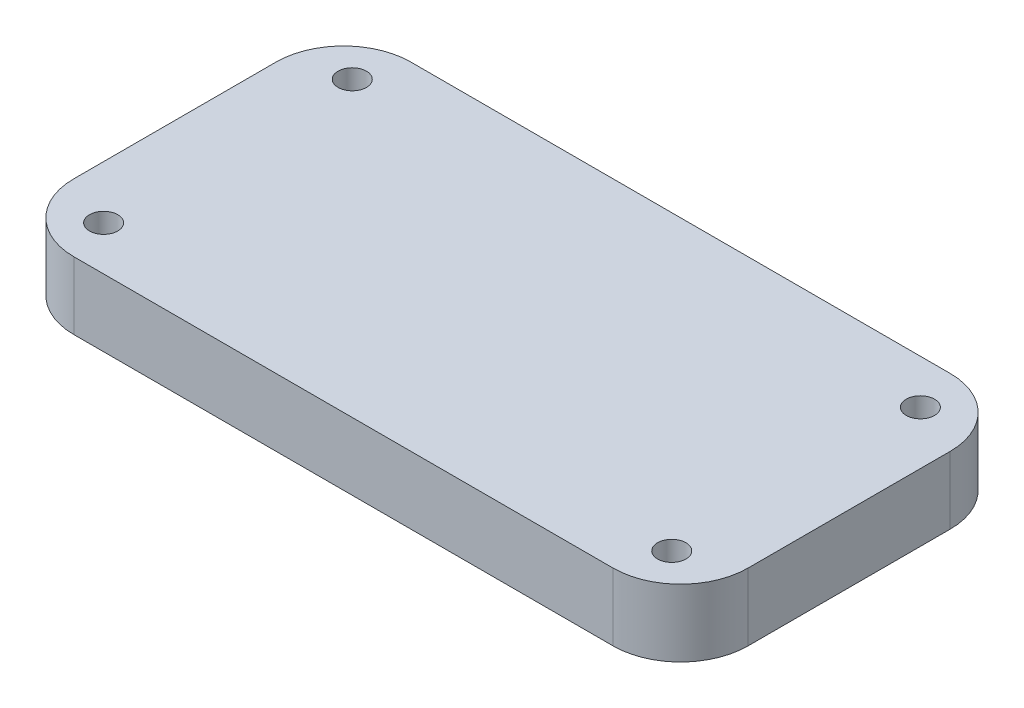
ISO-10303-21;
HEADER;
FILE_DESCRIPTION(('STEP AP214'),'2;1');
FILE_NAME('part.step','',(''),(''),'','','');
FILE_SCHEMA(('AUTOMOTIVE_DESIGN { 1 0 10303 214 1 1 1 1 }'));
ENDSEC;
DATA;
#1=APPLICATION_CONTEXT('core data for automotive mechanical design processes');
#2=APPLICATION_PROTOCOL_DEFINITION('international standard','automotive_design',2000,#1);
#3=PRODUCT_CONTEXT('',#1,'mechanical');
#4=PRODUCT('Part','Part','',(#3));
#5=PRODUCT_RELATED_PRODUCT_CATEGORY('part','',(#4));
#6=PRODUCT_DEFINITION_FORMATION('','',#4);
#7=PRODUCT_DEFINITION_CONTEXT('part definition',#1,'design');
#8=PRODUCT_DEFINITION('design','',#6,#7);
#9=PRODUCT_DEFINITION_SHAPE('','',#8);
#10=(LENGTH_UNIT() NAMED_UNIT(*) SI_UNIT(.MILLI.,.METRE.));
#11=(NAMED_UNIT(*) PLANE_ANGLE_UNIT() SI_UNIT($,.RADIAN.));
#12=(NAMED_UNIT(*) SI_UNIT($,.STERADIAN.) SOLID_ANGLE_UNIT());
#13=UNCERTAINTY_MEASURE_WITH_UNIT(LENGTH_MEASURE(1.E-05),#10,'distance_accuracy_value','');
#14=(GEOMETRIC_REPRESENTATION_CONTEXT(3) GLOBAL_UNCERTAINTY_ASSIGNED_CONTEXT((#13)) GLOBAL_UNIT_ASSIGNED_CONTEXT((#10,
#11,#12)) REPRESENTATION_CONTEXT('',''));
#15=CARTESIAN_POINT('',(0.,0.,0.));
#16=DIRECTION('',(0.,0.,1.));
#17=DIRECTION('',(1.,0.,0.));
#18=AXIS2_PLACEMENT_3D('',#15,#16,#17);
#19=CARTESIAN_POINT('',(-50.,10.,-25.));
#20=DIRECTION('',(1.,0.,0.));
#21=DIRECTION('',(0.,0.,-1.));
#22=AXIS2_PLACEMENT_3D('',#19,#20,#21);
#23=PLANE('',#22);
#24=DIRECTION('',(0.,0.,1.));
#25=VECTOR('',#24,1.);
#26=CARTESIAN_POINT('',(-50.,10.,-25.));
#27=LINE('',#26,#25);
#28=CARTESIAN_POINT('',(-50.,10.,-15.));
#29=VERTEX_POINT('',#28);
#30=CARTESIAN_POINT('',(-50.,10.,15.));
#31=VERTEX_POINT('',#30);
#32=EDGE_CURVE('E126',#29,#31,#27,.T.);
#33=ORIENTED_EDGE('',*,*,#32,.F.);
#34=DIRECTION('',(0.,-1.,0.));
#35=VECTOR('',#34,1.);
#36=CARTESIAN_POINT('',(-50.,10.,-15.));
#37=LINE('',#36,#35);
#38=CARTESIAN_POINT('',(-50.,0.,-15.));
#39=VERTEX_POINT('',#38);
#40=EDGE_CURVE('E111',#29,#39,#37,.T.);
#41=ORIENTED_EDGE('',*,*,#40,.T.);
#42=DIRECTION('',(0.,0.,1.));
#43=VECTOR('',#42,1.);
#44=CARTESIAN_POINT('',(-50.,0.,-25.));
#45=LINE('',#44,#43);
#46=CARTESIAN_POINT('',(-50.,0.,15.));
#47=VERTEX_POINT('',#46);
#48=EDGE_CURVE('E123',#39,#47,#45,.T.);
#49=ORIENTED_EDGE('',*,*,#48,.T.);
#50=DIRECTION('',(0.,-1.,0.));
#51=VECTOR('',#50,1.);
#52=CARTESIAN_POINT('',(-50.,10.,15.));
#53=LINE('',#52,#51);
#54=EDGE_CURVE('E128',#47,#31,#53,.F.);
#55=ORIENTED_EDGE('',*,*,#54,.T.);
#56=EDGE_LOOP('',(#33,#41,#49,#55));
#57=FACE_BOUND('',#56,.T.);
#58=ADVANCED_FACE('F41',(#57),#23,.F.);
#59=CARTESIAN_POINT('',(-50.,10.,25.));
#60=DIRECTION('',(0.,0.,-1.));
#61=DIRECTION('',(-1.,0.,0.));
#62=AXIS2_PLACEMENT_3D('',#59,#60,#61);
#63=PLANE('',#62);
#64=DIRECTION('',(1.,0.,0.));
#65=VECTOR('',#64,1.);
#66=CARTESIAN_POINT('',(-50.,0.,25.));
#67=LINE('',#66,#65);
#68=CARTESIAN_POINT('',(-40.,0.,25.));
#69=VERTEX_POINT('',#68);
#70=CARTESIAN_POINT('',(40.,0.,25.));
#71=VERTEX_POINT('',#70);
#72=EDGE_CURVE('E132',#69,#71,#67,.T.);
#73=ORIENTED_EDGE('',*,*,#72,.T.);
#74=DIRECTION('',(0.,-1.,0.));
#75=VECTOR('',#74,1.);
#76=CARTESIAN_POINT('',(40.,10.,25.));
#77=LINE('',#76,#75);
#78=CARTESIAN_POINT('',(40.,10.,25.));
#79=VERTEX_POINT('',#78);
#80=EDGE_CURVE('E11',#71,#79,#77,.F.);
#81=ORIENTED_EDGE('',*,*,#80,.T.);
#82=DIRECTION('',(1.,0.,0.));
#83=VECTOR('',#82,1.);
#84=CARTESIAN_POINT('',(-50.,10.,25.));
#85=LINE('',#84,#83);
#86=CARTESIAN_POINT('',(-40.,10.,25.));
#87=VERTEX_POINT('',#86);
#88=EDGE_CURVE('E172',#87,#79,#85,.T.);
#89=ORIENTED_EDGE('',*,*,#88,.F.);
#90=DIRECTION('',(0.,-1.,0.));
#91=VECTOR('',#90,1.);
#92=CARTESIAN_POINT('',(-40.,10.,25.));
#93=LINE('',#92,#91);
#94=EDGE_CURVE('E49',#87,#69,#93,.T.);
#95=ORIENTED_EDGE('',*,*,#94,.T.);
#96=EDGE_LOOP('',(#73,#81,#89,#95));
#97=FACE_BOUND('',#96,.T.);
#98=ADVANCED_FACE('F170',(#97),#63,.F.);
#99=CARTESIAN_POINT('',(50.,10.,-25.));
#100=DIRECTION('',(-1.,0.,0.));
#101=DIRECTION('',(0.,0.,1.));
#102=AXIS2_PLACEMENT_3D('',#99,#100,#101);
#103=PLANE('',#102);
#104=DIRECTION('',(0.,0.,-1.));
#105=VECTOR('',#104,1.);
#106=CARTESIAN_POINT('',(50.,0.,-25.));
#107=LINE('',#106,#105);
#108=CARTESIAN_POINT('',(50.,0.,15.));
#109=VERTEX_POINT('',#108);
#110=CARTESIAN_POINT('',(50.,0.,-15.));
#111=VERTEX_POINT('',#110);
#112=EDGE_CURVE('E136',#109,#111,#107,.T.);
#113=ORIENTED_EDGE('',*,*,#112,.T.);
#114=DIRECTION('',(0.,-1.,0.));
#115=VECTOR('',#114,1.);
#116=CARTESIAN_POINT('',(50.,10.,-15.));
#117=LINE('',#116,#115);
#118=CARTESIAN_POINT('',(50.,10.,-15.));
#119=VERTEX_POINT('',#118);
#120=EDGE_CURVE('E56',#111,#119,#117,.F.);
#121=ORIENTED_EDGE('',*,*,#120,.T.);
#122=DIRECTION('',(0.,0.,-1.));
#123=VECTOR('',#122,1.);
#124=CARTESIAN_POINT('',(50.,10.,-25.));
#125=LINE('',#124,#123);
#126=CARTESIAN_POINT('',(50.,10.,15.));
#127=VERTEX_POINT('',#126);
#128=EDGE_CURVE('E180',#127,#119,#125,.T.);
#129=ORIENTED_EDGE('',*,*,#128,.F.);
#130=DIRECTION('',(0.,-1.,0.));
#131=VECTOR('',#130,1.);
#132=CARTESIAN_POINT('',(50.,10.,15.));
#133=LINE('',#132,#131);
#134=EDGE_CURVE('E163',#127,#109,#133,.T.);
#135=ORIENTED_EDGE('',*,*,#134,.T.);
#136=EDGE_LOOP('',(#113,#121,#129,#135));
#137=FACE_BOUND('',#136,.T.);
#138=ADVANCED_FACE('F179',(#137),#103,.F.);
#139=CARTESIAN_POINT('',(-50.,10.,-25.));
#140=DIRECTION('',(0.,0.,1.));
#141=DIRECTION('',(1.,0.,0.));
#142=AXIS2_PLACEMENT_3D('',#139,#140,#141);
#143=PLANE('',#142);
#144=DIRECTION('',(-1.,0.,0.));
#145=VECTOR('',#144,1.);
#146=CARTESIAN_POINT('',(-50.,0.,-25.));
#147=LINE('',#146,#145);
#148=CARTESIAN_POINT('',(40.,0.,-25.));
#149=VERTEX_POINT('',#148);
#150=CARTESIAN_POINT('',(-40.,0.,-25.));
#151=VERTEX_POINT('',#150);
#152=EDGE_CURVE('E146',#149,#151,#147,.T.);
#153=ORIENTED_EDGE('',*,*,#152,.T.);
#154=DIRECTION('',(0.,-1.,0.));
#155=VECTOR('',#154,1.);
#156=CARTESIAN_POINT('',(-40.,10.,-25.));
#157=LINE('',#156,#155);
#158=CARTESIAN_POINT('',(-40.,10.,-25.));
#159=VERTEX_POINT('',#158);
#160=EDGE_CURVE('E112',#151,#159,#157,.F.);
#161=ORIENTED_EDGE('',*,*,#160,.T.);
#162=DIRECTION('',(-1.,0.,0.));
#163=VECTOR('',#162,1.);
#164=CARTESIAN_POINT('',(-50.,10.,-25.));
#165=LINE('',#164,#163);
#166=CARTESIAN_POINT('',(40.,10.,-25.));
#167=VERTEX_POINT('',#166);
#168=EDGE_CURVE('E142',#167,#159,#165,.T.);
#169=ORIENTED_EDGE('',*,*,#168,.F.);
#170=DIRECTION('',(0.,-1.,0.));
#171=VECTOR('',#170,1.);
#172=CARTESIAN_POINT('',(40.,10.,-25.));
#173=LINE('',#172,#171);
#174=EDGE_CURVE('E117',#167,#149,#173,.T.);
#175=ORIENTED_EDGE('',*,*,#174,.T.);
#176=EDGE_LOOP('',(#153,#161,#169,#175));
#177=FACE_BOUND('',#176,.T.);
#178=ADVANCED_FACE('F212',(#177),#143,.F.);
#179=CARTESIAN_POINT('',(0.,10.,0.));
#180=DIRECTION('',(0.,1.,0.));
#181=DIRECTION('',(0.,0.,1.));
#182=AXIS2_PLACEMENT_3D('',#179,#180,#181);
#183=PLANE('',#182);
#184=CARTESIAN_POINT('',(-42.1323843658624,10.,18.4388893029738));
#185=DIRECTION('',(0.,1.,0.));
#186=DIRECTION('',(0.,0.,1.));
#187=AXIS2_PLACEMENT_3D('',#184,#185,#186);
#188=CIRCLE('',#187,2.1);
#189=CARTESIAN_POINT('',(-42.1323843658624,10.,20.5388893029738));
#190=VERTEX_POINT('',#189);
#191=EDGE_CURVE('E192',#190,#190,#188,.T.);
#192=ORIENTED_EDGE('',*,*,#191,.F.);
#193=EDGE_LOOP('',(#192));
#194=FACE_BOUND('',#193,.T.);
#195=CARTESIAN_POINT('',(42.1323843658624,10.,18.4388893029738));
#196=DIRECTION('',(0.,1.,0.));
#197=DIRECTION('',(0.,0.,1.));
#198=AXIS2_PLACEMENT_3D('',#195,#196,#197);
#199=CIRCLE('',#198,2.1);
#200=CARTESIAN_POINT('',(42.1323843658624,10.,20.5388893029738));
#201=VERTEX_POINT('',#200);
#202=EDGE_CURVE('E198',#201,#201,#199,.T.);
#203=ORIENTED_EDGE('',*,*,#202,.F.);
#204=EDGE_LOOP('',(#203));
#205=FACE_BOUND('',#204,.T.);
#206=CARTESIAN_POINT('',(42.1323843658624,10.,-18.4388893029738));
#207=DIRECTION('',(0.,1.,0.));
#208=DIRECTION('',(0.,0.,1.));
#209=AXIS2_PLACEMENT_3D('',#206,#207,#208);
#210=CIRCLE('',#209,2.1);
#211=CARTESIAN_POINT('',(42.1323843658624,10.,-16.3388893029738));
#212=VERTEX_POINT('',#211);
#213=EDGE_CURVE('E187',#212,#212,#210,.T.);
#214=ORIENTED_EDGE('',*,*,#213,.F.);
#215=EDGE_LOOP('',(#214));
#216=FACE_BOUND('',#215,.T.);
#217=CARTESIAN_POINT('',(-42.1323843658624,10.,-18.4388893029738));
#218=DIRECTION('',(0.,1.,0.));
#219=DIRECTION('',(0.,0.,1.));
#220=AXIS2_PLACEMENT_3D('',#217,#218,#219);
#221=CIRCLE('',#220,2.1);
#222=CARTESIAN_POINT('',(-42.1323843658624,10.,-16.3388893029738));
#223=VERTEX_POINT('',#222);
#224=EDGE_CURVE('E139',#223,#223,#221,.T.);
#225=ORIENTED_EDGE('',*,*,#224,.F.);
#226=EDGE_LOOP('',(#225));
#227=FACE_BOUND('',#226,.T.);
#228=ORIENTED_EDGE('',*,*,#168,.T.);
#229=CARTESIAN_POINT('',(-40.,10.,-15.));
#230=DIRECTION('',(0.,1.,0.));
#231=DIRECTION('',(0.,0.,1.));
#232=AXIS2_PLACEMENT_3D('',#229,#230,#231);
#233=CIRCLE('',#232,10.);
#234=EDGE_CURVE('E161',#159,#29,#233,.T.);
#235=ORIENTED_EDGE('',*,*,#234,.T.);
#236=ORIENTED_EDGE('',*,*,#32,.T.);
#237=CARTESIAN_POINT('',(-40.,10.,15.));
#238=DIRECTION('',(0.,1.,0.));
#239=DIRECTION('',(0.,0.,1.));
#240=AXIS2_PLACEMENT_3D('',#237,#238,#239);
#241=CIRCLE('',#240,10.);
#242=EDGE_CURVE('E156',#31,#87,#241,.T.);
#243=ORIENTED_EDGE('',*,*,#242,.T.);
#244=ORIENTED_EDGE('',*,*,#88,.T.);
#245=CARTESIAN_POINT('',(40.,10.,15.));
#246=DIRECTION('',(0.,1.,0.));
#247=DIRECTION('',(0.,0.,1.));
#248=AXIS2_PLACEMENT_3D('',#245,#246,#247);
#249=CIRCLE('',#248,10.);
#250=EDGE_CURVE('E63',#79,#127,#249,.T.);
#251=ORIENTED_EDGE('',*,*,#250,.T.);
#252=ORIENTED_EDGE('',*,*,#128,.T.);
#253=CARTESIAN_POINT('',(40.,10.,-15.));
#254=DIRECTION('',(0.,1.,0.));
#255=DIRECTION('',(0.,0.,1.));
#256=AXIS2_PLACEMENT_3D('',#253,#254,#255);
#257=CIRCLE('',#256,10.);
#258=EDGE_CURVE('E159',#119,#167,#257,.T.);
#259=ORIENTED_EDGE('',*,*,#258,.T.);
#260=EDGE_LOOP('',(#228,#235,#236,#243,#244,#251,#252,#259));
#261=FACE_BOUND('',#260,.T.);
#262=ADVANCED_FACE('F209',(#194,#205,#216,#227,#261),#183,.T.);
#263=CARTESIAN_POINT('',(0.,0.,0.));
#264=DIRECTION('',(0.,1.,0.));
#265=DIRECTION('',(0.,0.,1.));
#266=AXIS2_PLACEMENT_3D('',#263,#264,#265);
#267=PLANE('',#266);
#268=CARTESIAN_POINT('',(-42.1323843658624,0.,18.4388893029738));
#269=DIRECTION('',(0.,1.,0.));
#270=DIRECTION('',(0.,0.,1.));
#271=AXIS2_PLACEMENT_3D('',#268,#269,#270);
#272=CIRCLE('',#271,2.1);
#273=CARTESIAN_POINT('',(-42.1323843658624,0.,20.5388893029738));
#274=VERTEX_POINT('',#273);
#275=EDGE_CURVE('E189',#274,#274,#272,.T.);
#276=ORIENTED_EDGE('',*,*,#275,.T.);
#277=EDGE_LOOP('',(#276));
#278=FACE_BOUND('',#277,.T.);
#279=CARTESIAN_POINT('',(42.1323843658624,0.,18.4388893029738));
#280=DIRECTION('',(0.,1.,0.));
#281=DIRECTION('',(0.,0.,1.));
#282=AXIS2_PLACEMENT_3D('',#279,#280,#281);
#283=CIRCLE('',#282,2.1);
#284=CARTESIAN_POINT('',(42.1323843658624,0.,20.5388893029738));
#285=VERTEX_POINT('',#284);
#286=EDGE_CURVE('E195',#285,#285,#283,.T.);
#287=ORIENTED_EDGE('',*,*,#286,.T.);
#288=EDGE_LOOP('',(#287));
#289=FACE_BOUND('',#288,.T.);
#290=CARTESIAN_POINT('',(42.1323843658624,0.,-18.4388893029738));
#291=DIRECTION('',(0.,1.,0.));
#292=DIRECTION('',(0.,0.,1.));
#293=AXIS2_PLACEMENT_3D('',#290,#291,#292);
#294=CIRCLE('',#293,2.1);
#295=CARTESIAN_POINT('',(42.1323843658624,0.,-16.3388893029738));
#296=VERTEX_POINT('',#295);
#297=EDGE_CURVE('E201',#296,#296,#294,.T.);
#298=ORIENTED_EDGE('',*,*,#297,.T.);
#299=EDGE_LOOP('',(#298));
#300=FACE_BOUND('',#299,.T.);
#301=CARTESIAN_POINT('',(-42.1323843658624,0.,-18.4388893029738));
#302=DIRECTION('',(0.,1.,0.));
#303=DIRECTION('',(0.,0.,1.));
#304=AXIS2_PLACEMENT_3D('',#301,#302,#303);
#305=CIRCLE('',#304,2.1);
#306=CARTESIAN_POINT('',(-42.1323843658624,0.,-16.3388893029738));
#307=VERTEX_POINT('',#306);
#308=EDGE_CURVE('E133',#307,#307,#305,.T.);
#309=ORIENTED_EDGE('',*,*,#308,.T.);
#310=EDGE_LOOP('',(#309));
#311=FACE_BOUND('',#310,.T.);
#312=ORIENTED_EDGE('',*,*,#48,.F.);
#313=CARTESIAN_POINT('',(-40.,0.,-15.));
#314=DIRECTION('',(0.,1.,0.));
#315=DIRECTION('',(0.,0.,1.));
#316=AXIS2_PLACEMENT_3D('',#313,#314,#315);
#317=CIRCLE('',#316,10.);
#318=EDGE_CURVE('E107',#39,#151,#317,.F.);
#319=ORIENTED_EDGE('',*,*,#318,.T.);
#320=ORIENTED_EDGE('',*,*,#152,.F.);
#321=CARTESIAN_POINT('',(40.,0.,-15.));
#322=DIRECTION('',(0.,1.,0.));
#323=DIRECTION('',(0.,0.,1.));
#324=AXIS2_PLACEMENT_3D('',#321,#322,#323);
#325=CIRCLE('',#324,10.);
#326=EDGE_CURVE('E118',#149,#111,#325,.F.);
#327=ORIENTED_EDGE('',*,*,#326,.T.);
#328=ORIENTED_EDGE('',*,*,#112,.F.);
#329=CARTESIAN_POINT('',(40.,0.,15.));
#330=DIRECTION('',(0.,1.,0.));
#331=DIRECTION('',(0.,0.,1.));
#332=AXIS2_PLACEMENT_3D('',#329,#330,#331);
#333=CIRCLE('',#332,10.);
#334=EDGE_CURVE('E150',#109,#71,#333,.F.);
#335=ORIENTED_EDGE('',*,*,#334,.T.);
#336=ORIENTED_EDGE('',*,*,#72,.F.);
#337=CARTESIAN_POINT('',(-40.,0.,15.));
#338=DIRECTION('',(0.,1.,0.));
#339=DIRECTION('',(0.,0.,1.));
#340=AXIS2_PLACEMENT_3D('',#337,#338,#339);
#341=CIRCLE('',#340,10.);
#342=EDGE_CURVE('E127',#69,#47,#341,.F.);
#343=ORIENTED_EDGE('',*,*,#342,.T.);
#344=EDGE_LOOP('',(#312,#319,#320,#327,#328,#335,#336,#343));
#345=FACE_BOUND('',#344,.T.);
#346=ADVANCED_FACE('F130',(#278,#289,#300,#311,#345),#267,.F.);
#347=CARTESIAN_POINT('',(-40.,10.,-15.));
#348=DIRECTION('',(0.,-1.,0.));
#349=DIRECTION('',(0.,0.,-1.));
#350=AXIS2_PLACEMENT_3D('',#347,#348,#349);
#351=CYLINDRICAL_SURFACE('',#350,10.);
#352=ORIENTED_EDGE('',*,*,#234,.F.);
#353=ORIENTED_EDGE('',*,*,#160,.F.);
#354=ORIENTED_EDGE('',*,*,#318,.F.);
#355=ORIENTED_EDGE('',*,*,#40,.F.);
#356=EDGE_LOOP('',(#352,#353,#354,#355));
#357=FACE_BOUND('',#356,.T.);
#358=ADVANCED_FACE('F110',(#357),#351,.T.);
#359=CARTESIAN_POINT('',(40.,10.,-15.));
#360=DIRECTION('',(0.,-1.,0.));
#361=DIRECTION('',(0.,0.,-1.));
#362=AXIS2_PLACEMENT_3D('',#359,#360,#361);
#363=CYLINDRICAL_SURFACE('',#362,10.);
#364=ORIENTED_EDGE('',*,*,#258,.F.);
#365=ORIENTED_EDGE('',*,*,#120,.F.);
#366=ORIENTED_EDGE('',*,*,#326,.F.);
#367=ORIENTED_EDGE('',*,*,#174,.F.);
#368=EDGE_LOOP('',(#364,#365,#366,#367));
#369=FACE_BOUND('',#368,.T.);
#370=ADVANCED_FACE('F220',(#369),#363,.T.);
#371=CARTESIAN_POINT('',(40.,10.,15.));
#372=DIRECTION('',(0.,-1.,0.));
#373=DIRECTION('',(0.,0.,-1.));
#374=AXIS2_PLACEMENT_3D('',#371,#372,#373);
#375=CYLINDRICAL_SURFACE('',#374,10.);
#376=ORIENTED_EDGE('',*,*,#250,.F.);
#377=ORIENTED_EDGE('',*,*,#80,.F.);
#378=ORIENTED_EDGE('',*,*,#334,.F.);
#379=ORIENTED_EDGE('',*,*,#134,.F.);
#380=EDGE_LOOP('',(#376,#377,#378,#379));
#381=FACE_BOUND('',#380,.T.);
#382=ADVANCED_FACE('F178',(#381),#375,.T.);
#383=CARTESIAN_POINT('',(-40.,10.,15.));
#384=DIRECTION('',(0.,-1.,0.));
#385=DIRECTION('',(0.,0.,-1.));
#386=AXIS2_PLACEMENT_3D('',#383,#384,#385);
#387=CYLINDRICAL_SURFACE('',#386,10.);
#388=ORIENTED_EDGE('',*,*,#242,.F.);
#389=ORIENTED_EDGE('',*,*,#54,.F.);
#390=ORIENTED_EDGE('',*,*,#342,.F.);
#391=ORIENTED_EDGE('',*,*,#94,.F.);
#392=EDGE_LOOP('',(#388,#389,#390,#391));
#393=FACE_BOUND('',#392,.T.);
#394=ADVANCED_FACE('F43',(#393),#387,.T.);
#395=CARTESIAN_POINT('',(-42.1323843658624,0.,-18.4388893029738));
#396=DIRECTION('',(0.,1.,0.));
#397=DIRECTION('',(0.,0.,1.));
#398=AXIS2_PLACEMENT_3D('',#395,#396,#397);
#399=CYLINDRICAL_SURFACE('',#398,2.1);
#400=ORIENTED_EDGE('',*,*,#308,.F.);
#401=EDGE_LOOP('',(#400));
#402=FACE_BOUND('',#401,.T.);
#403=ORIENTED_EDGE('',*,*,#224,.T.);
#404=EDGE_LOOP('',(#403));
#405=FACE_BOUND('',#404,.T.);
#406=ADVANCED_FACE('F242',(#402,#405),#399,.F.);
#407=CARTESIAN_POINT('',(42.1323843658624,0.,-18.4388893029738));
#408=DIRECTION('',(0.,1.,0.));
#409=DIRECTION('',(0.,0.,1.));
#410=AXIS2_PLACEMENT_3D('',#407,#408,#409);
#411=CYLINDRICAL_SURFACE('',#410,2.1);
#412=ORIENTED_EDGE('',*,*,#297,.F.);
#413=EDGE_LOOP('',(#412));
#414=FACE_BOUND('',#413,.T.);
#415=ORIENTED_EDGE('',*,*,#213,.T.);
#416=EDGE_LOOP('',(#415));
#417=FACE_BOUND('',#416,.T.);
#418=ADVANCED_FACE('F207',(#414,#417),#411,.F.);
#419=CARTESIAN_POINT('',(42.1323843658624,0.,18.4388893029738));
#420=DIRECTION('',(0.,1.,0.));
#421=DIRECTION('',(0.,0.,1.));
#422=AXIS2_PLACEMENT_3D('',#419,#420,#421);
#423=CYLINDRICAL_SURFACE('',#422,2.1);
#424=ORIENTED_EDGE('',*,*,#286,.F.);
#425=EDGE_LOOP('',(#424));
#426=FACE_BOUND('',#425,.T.);
#427=ORIENTED_EDGE('',*,*,#202,.T.);
#428=EDGE_LOOP('',(#427));
#429=FACE_BOUND('',#428,.T.);
#430=ADVANCED_FACE('F249',(#426,#429),#423,.F.);
#431=CARTESIAN_POINT('',(-42.1323843658624,0.,18.4388893029738));
#432=DIRECTION('',(0.,1.,0.));
#433=DIRECTION('',(0.,0.,1.));
#434=AXIS2_PLACEMENT_3D('',#431,#432,#433);
#435=CYLINDRICAL_SURFACE('',#434,2.1);
#436=ORIENTED_EDGE('',*,*,#275,.F.);
#437=EDGE_LOOP('',(#436));
#438=FACE_BOUND('',#437,.T.);
#439=ORIENTED_EDGE('',*,*,#191,.T.);
#440=EDGE_LOOP('',(#439));
#441=FACE_BOUND('',#440,.T.);
#442=ADVANCED_FACE('F246',(#438,#441),#435,.F.);
#443=CLOSED_SHELL('',(#58,#98,#138,#178,#262,#346,#358,#370,#382,#394,#406,#418,#430,#442));
#444=MANIFOLD_SOLID_BREP('B2',#443);
#445=ADVANCED_BREP_SHAPE_REPRESENTATION('',(#18,#444),#14);
#446=SHAPE_DEFINITION_REPRESENTATION(#9,#445);
ENDSEC;
END-ISO-10303-21;
